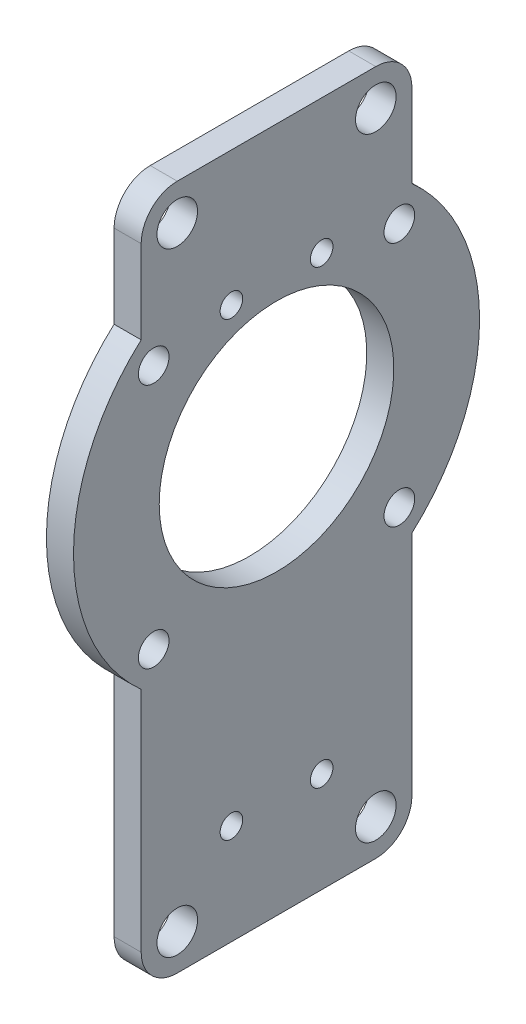
ISO-10303-21;
HEADER;
FILE_DESCRIPTION(('STEP AP214'),'2;1');
FILE_NAME('part.step','',(''),(''),'','','');
FILE_SCHEMA(('AUTOMOTIVE_DESIGN { 1 0 10303 214 1 1 1 1 }'));
ENDSEC;
DATA;
#1=APPLICATION_CONTEXT('core data for automotive mechanical design processes');
#2=APPLICATION_PROTOCOL_DEFINITION('international standard','automotive_design',2000,#1);
#3=PRODUCT_CONTEXT('',#1,'mechanical');
#4=PRODUCT('Part','Part','',(#3));
#5=PRODUCT_RELATED_PRODUCT_CATEGORY('part','',(#4));
#6=PRODUCT_DEFINITION_FORMATION('','',#4);
#7=PRODUCT_DEFINITION_CONTEXT('part definition',#1,'design');
#8=PRODUCT_DEFINITION('design','',#6,#7);
#9=PRODUCT_DEFINITION_SHAPE('','',#8);
#10=(LENGTH_UNIT() NAMED_UNIT(*) SI_UNIT(.MILLI.,.METRE.));
#11=(NAMED_UNIT(*) PLANE_ANGLE_UNIT() SI_UNIT($,.RADIAN.));
#12=(NAMED_UNIT(*) SI_UNIT($,.STERADIAN.) SOLID_ANGLE_UNIT());
#13=UNCERTAINTY_MEASURE_WITH_UNIT(LENGTH_MEASURE(1.E-05),#10,'distance_accuracy_value','');
#14=(GEOMETRIC_REPRESENTATION_CONTEXT(3) GLOBAL_UNCERTAINTY_ASSIGNED_CONTEXT((#13)) GLOBAL_UNIT_ASSIGNED_CONTEXT((#10,
#11,#12)) REPRESENTATION_CONTEXT('',''));
#15=CARTESIAN_POINT('',(0.,0.,0.));
#16=DIRECTION('',(0.,0.,1.));
#17=DIRECTION('',(1.,0.,0.));
#18=AXIS2_PLACEMENT_3D('',#15,#16,#17);
#19=CARTESIAN_POINT('',(0.,76.,0.));
#20=DIRECTION('',(1.,0.,0.));
#21=DIRECTION('',(0.,0.,-1.));
#22=AXIS2_PLACEMENT_3D('',#19,#20,#21);
#23=PLANE('',#22);
#24=CARTESIAN_POINT('',(0.,61.12,20.));
#25=DIRECTION('',(-1.,0.,0.));
#26=DIRECTION('',(0.,0.,1.));
#27=AXIS2_PLACEMENT_3D('',#24,#25,#26);
#28=CIRCLE('',#27,1.24999999999999);
#29=CARTESIAN_POINT('',(0.,61.12,21.25));
#30=VERTEX_POINT('',#29);
#31=EDGE_CURVE('E305',#30,#30,#28,.T.);
#32=ORIENTED_EDGE('',*,*,#31,.F.);
#33=EDGE_LOOP('',(#32));
#34=FACE_BOUND('',#33,.T.);
#35=CARTESIAN_POINT('',(0.,11.12,20.));
#36=DIRECTION('',(-1.,0.,0.));
#37=DIRECTION('',(0.,0.,1.));
#38=AXIS2_PLACEMENT_3D('',#35,#36,#37);
#39=CIRCLE('',#38,1.24999999999999);
#40=CARTESIAN_POINT('',(0.,11.12,21.25));
#41=VERTEX_POINT('',#40);
#42=EDGE_CURVE('E293',#41,#41,#39,.T.);
#43=ORIENTED_EDGE('',*,*,#42,.F.);
#44=EDGE_LOOP('',(#43));
#45=FACE_BOUND('',#44,.T.);
#46=CARTESIAN_POINT('',(0.,72.,26.));
#47=DIRECTION('',(1.,0.,0.));
#48=DIRECTION('',(0.,0.,-1.));
#49=AXIS2_PLACEMENT_3D('',#46,#47,#48);
#50=CIRCLE('',#49,2.25);
#51=CARTESIAN_POINT('',(0.,72.,23.75));
#52=VERTEX_POINT('',#51);
#53=EDGE_CURVE('E284',#52,#52,#50,.T.);
#54=ORIENTED_EDGE('',*,*,#53,.T.);
#55=EDGE_LOOP('',(#54));
#56=FACE_BOUND('',#55,.T.);
#57=CARTESIAN_POINT('',(0.,72.,3.99999999999999));
#58=DIRECTION('',(1.,0.,0.));
#59=DIRECTION('',(0.,0.,-1.));
#60=AXIS2_PLACEMENT_3D('',#57,#58,#59);
#61=CIRCLE('',#60,2.25);
#62=CARTESIAN_POINT('',(0.,72.,1.74999999999999));
#63=VERTEX_POINT('',#62);
#64=EDGE_CURVE('E278',#63,#63,#61,.T.);
#65=ORIENTED_EDGE('',*,*,#64,.T.);
#66=EDGE_LOOP('',(#65));
#67=FACE_BOUND('',#66,.T.);
#68=CARTESIAN_POINT('',(0.,4.,4.));
#69=DIRECTION('',(1.,0.,0.));
#70=DIRECTION('',(0.,0.,-1.));
#71=AXIS2_PLACEMENT_3D('',#68,#69,#70);
#72=CIRCLE('',#71,2.25);
#73=CARTESIAN_POINT('',(0.,4.,1.75));
#74=VERTEX_POINT('',#73);
#75=EDGE_CURVE('E272',#74,#74,#72,.T.);
#76=ORIENTED_EDGE('',*,*,#75,.T.);
#77=EDGE_LOOP('',(#76));
#78=FACE_BOUND('',#77,.T.);
#79=CARTESIAN_POINT('',(0.,4.,26.));
#80=DIRECTION('',(1.,0.,0.));
#81=DIRECTION('',(0.,0.,-1.));
#82=AXIS2_PLACEMENT_3D('',#79,#80,#81);
#83=CIRCLE('',#82,2.25);
#84=CARTESIAN_POINT('',(0.,4.,23.75));
#85=VERTEX_POINT('',#84);
#86=EDGE_CURVE('E266',#85,#85,#83,.T.);
#87=ORIENTED_EDGE('',*,*,#86,.T.);
#88=EDGE_LOOP('',(#87));
#89=FACE_BOUND('',#88,.T.);
#90=CARTESIAN_POINT('',(0.,59.6118055378411,28.6118055378411));
#91=DIRECTION('',(1.,0.,0.));
#92=DIRECTION('',(0.,0.,-1.));
#93=AXIS2_PLACEMENT_3D('',#90,#91,#92);
#94=CIRCLE('',#93,1.7);
#95=CARTESIAN_POINT('',(0.,59.6118055378411,26.9118055378411));
#96=VERTEX_POINT('',#95);
#97=EDGE_CURVE('E260',#96,#96,#94,.T.);
#98=ORIENTED_EDGE('',*,*,#97,.T.);
#99=EDGE_LOOP('',(#98));
#100=FACE_BOUND('',#99,.T.);
#101=CARTESIAN_POINT('',(0.,59.6118055378411,1.38819446215899));
#102=DIRECTION('',(1.,0.,0.));
#103=DIRECTION('',(0.,0.,-1.));
#104=AXIS2_PLACEMENT_3D('',#101,#102,#103);
#105=CIRCLE('',#104,1.7);
#106=CARTESIAN_POINT('',(0.,59.6118055378411,-0.311805537841006));
#107=VERTEX_POINT('',#106);
#108=EDGE_CURVE('E254',#107,#107,#105,.T.);
#109=ORIENTED_EDGE('',*,*,#108,.T.);
#110=EDGE_LOOP('',(#109));
#111=FACE_BOUND('',#110,.T.);
#112=CARTESIAN_POINT('',(0.,32.388194462159,1.38819446215893));
#113=DIRECTION('',(1.,0.,0.));
#114=DIRECTION('',(0.,0.,-1.));
#115=AXIS2_PLACEMENT_3D('',#112,#113,#114);
#116=CIRCLE('',#115,1.7);
#117=CARTESIAN_POINT('',(0.,32.388194462159,-0.311805537841071));
#118=VERTEX_POINT('',#117);
#119=EDGE_CURVE('E248',#118,#118,#116,.T.);
#120=ORIENTED_EDGE('',*,*,#119,.T.);
#121=EDGE_LOOP('',(#120));
#122=FACE_BOUND('',#121,.T.);
#123=CARTESIAN_POINT('',(0.,32.3881944621591,28.611805537841));
#124=DIRECTION('',(1.,0.,0.));
#125=DIRECTION('',(0.,0.,-1.));
#126=AXIS2_PLACEMENT_3D('',#123,#124,#125);
#127=CIRCLE('',#126,1.7);
#128=CARTESIAN_POINT('',(0.,32.3881944621591,26.911805537841));
#129=VERTEX_POINT('',#128);
#130=EDGE_CURVE('E241',#129,#129,#127,.T.);
#131=ORIENTED_EDGE('',*,*,#130,.T.);
#132=EDGE_LOOP('',(#131));
#133=FACE_BOUND('',#132,.T.);
#134=CARTESIAN_POINT('',(0.,46.,15.));
#135=DIRECTION('',(-1.,0.,0.));
#136=DIRECTION('',(0.,0.,1.));
#137=AXIS2_PLACEMENT_3D('',#134,#135,#136);
#138=CIRCLE('',#137,13.);
#139=CARTESIAN_POINT('',(0.,46.,28.));
#140=VERTEX_POINT('',#139);
#141=EDGE_CURVE('E236',#140,#140,#138,.T.);
#142=ORIENTED_EDGE('',*,*,#141,.F.);
#143=EDGE_LOOP('',(#142));
#144=FACE_BOUND('',#143,.T.);
#145=DIRECTION('',(0.,-1.,0.));
#146=VECTOR('',#145,1.);
#147=CARTESIAN_POINT('',(0.,76.,0.));
#148=LINE('',#147,#146);
#149=CARTESIAN_POINT('',(0.,29.2294901687516,0.));
#150=VERTEX_POINT('',#149);
#151=CARTESIAN_POINT('',(0.,4.,0.));
#152=VERTEX_POINT('',#151);
#153=EDGE_CURVE('E144',#150,#152,#148,.T.);
#154=ORIENTED_EDGE('',*,*,#153,.T.);
#155=CARTESIAN_POINT('',(0.,4.,4.));
#156=DIRECTION('',(1.,0.,0.));
#157=DIRECTION('',(0.,0.,-1.));
#158=AXIS2_PLACEMENT_3D('',#155,#156,#157);
#159=CIRCLE('',#158,4.);
#160=CARTESIAN_POINT('',(0.,0.,4.));
#161=VERTEX_POINT('',#160);
#162=EDGE_CURVE('E193',#152,#161,#159,.F.);
#163=ORIENTED_EDGE('',*,*,#162,.T.);
#164=DIRECTION('',(0.,0.,1.));
#165=VECTOR('',#164,1.);
#166=CARTESIAN_POINT('',(0.,0.,0.));
#167=LINE('',#166,#165);
#168=CARTESIAN_POINT('',(0.,0.,26.));
#169=VERTEX_POINT('',#168);
#170=EDGE_CURVE('E167',#161,#169,#167,.T.);
#171=ORIENTED_EDGE('',*,*,#170,.T.);
#172=CARTESIAN_POINT('',(0.,4.,26.));
#173=DIRECTION('',(1.,0.,0.));
#174=DIRECTION('',(0.,0.,-1.));
#175=AXIS2_PLACEMENT_3D('',#172,#173,#174);
#176=CIRCLE('',#175,4.);
#177=CARTESIAN_POINT('',(0.,4.,30.));
#178=VERTEX_POINT('',#177);
#179=EDGE_CURVE('E191',#169,#178,#176,.F.);
#180=ORIENTED_EDGE('',*,*,#179,.T.);
#181=DIRECTION('',(0.,-1.,0.));
#182=VECTOR('',#181,1.);
#183=CARTESIAN_POINT('',(0.,76.,30.));
#184=LINE('',#183,#182);
#185=CARTESIAN_POINT('',(0.,29.2294901687516,30.));
#186=VERTEX_POINT('',#185);
#187=EDGE_CURVE('E182',#186,#178,#184,.T.);
#188=ORIENTED_EDGE('',*,*,#187,.F.);
#189=CARTESIAN_POINT('',(0.,46.,15.));
#190=DIRECTION('',(-1.,0.,0.));
#191=DIRECTION('',(0.,0.,1.));
#192=AXIS2_PLACEMENT_3D('',#189,#190,#191);
#193=CIRCLE('',#192,22.5);
#194=CARTESIAN_POINT('',(0.,62.7705098312484,30.));
#195=VERTEX_POINT('',#194);
#196=EDGE_CURVE('E162',#186,#195,#193,.T.);
#197=ORIENTED_EDGE('',*,*,#196,.T.);
#198=CARTESIAN_POINT('',(0.,72.,30.));
#199=VERTEX_POINT('',#198);
#200=EDGE_CURVE('E149',#199,#195,#184,.T.);
#201=ORIENTED_EDGE('',*,*,#200,.F.);
#202=CARTESIAN_POINT('',(0.,72.,26.));
#203=DIRECTION('',(1.,0.,0.));
#204=DIRECTION('',(0.,0.,-1.));
#205=AXIS2_PLACEMENT_3D('',#202,#203,#204);
#206=CIRCLE('',#205,4.);
#207=CARTESIAN_POINT('',(0.,76.,26.));
#208=VERTEX_POINT('',#207);
#209=EDGE_CURVE('E189',#199,#208,#206,.F.);
#210=ORIENTED_EDGE('',*,*,#209,.T.);
#211=DIRECTION('',(0.,0.,1.));
#212=VECTOR('',#211,1.);
#213=CARTESIAN_POINT('',(0.,76.,0.));
#214=LINE('',#213,#212);
#215=CARTESIAN_POINT('',(0.,76.,4.));
#216=VERTEX_POINT('',#215);
#217=EDGE_CURVE('E168',#216,#208,#214,.T.);
#218=ORIENTED_EDGE('',*,*,#217,.F.);
#219=CARTESIAN_POINT('',(0.,72.,4.));
#220=DIRECTION('',(1.,0.,0.));
#221=DIRECTION('',(0.,0.,-1.));
#222=AXIS2_PLACEMENT_3D('',#219,#220,#221);
#223=CIRCLE('',#222,4.);
#224=CARTESIAN_POINT('',(0.,72.,0.));
#225=VERTEX_POINT('',#224);
#226=EDGE_CURVE('E187',#216,#225,#223,.F.);
#227=ORIENTED_EDGE('',*,*,#226,.T.);
#228=CARTESIAN_POINT('',(0.,62.7705098312484,0.));
#229=VERTEX_POINT('',#228);
#230=EDGE_CURVE('E138',#225,#229,#148,.T.);
#231=ORIENTED_EDGE('',*,*,#230,.T.);
#232=EDGE_CURVE('E160',#229,#150,#193,.T.);
#233=ORIENTED_EDGE('',*,*,#232,.T.);
#234=EDGE_LOOP('',(#154,#163,#171,#180,#188,#197,#201,#210,#218,#227,#231,#233));
#235=FACE_BOUND('',#234,.T.);
#236=CARTESIAN_POINT('',(0.,11.12,9.99999999999999));
#237=DIRECTION('',(-1.,0.,0.));
#238=DIRECTION('',(0.,0.,1.));
#239=AXIS2_PLACEMENT_3D('',#236,#237,#238);
#240=CIRCLE('',#239,1.24999999999999);
#241=CARTESIAN_POINT('',(0.,11.12,11.25));
#242=VERTEX_POINT('',#241);
#243=EDGE_CURVE('E299',#242,#242,#240,.T.);
#244=ORIENTED_EDGE('',*,*,#243,.F.);
#245=EDGE_LOOP('',(#244));
#246=FACE_BOUND('',#245,.T.);
#247=CARTESIAN_POINT('',(0.,61.12,10.));
#248=DIRECTION('',(-1.,0.,0.));
#249=DIRECTION('',(0.,0.,1.));
#250=AXIS2_PLACEMENT_3D('',#247,#248,#249);
#251=CIRCLE('',#250,1.24999999999999);
#252=CARTESIAN_POINT('',(0.,61.12,11.25));
#253=VERTEX_POINT('',#252);
#254=EDGE_CURVE('E311',#253,#253,#251,.T.);
#255=ORIENTED_EDGE('',*,*,#254,.F.);
#256=EDGE_LOOP('',(#255));
#257=FACE_BOUND('',#256,.T.);
#258=ADVANCED_FACE('F37',(#34,#45,#56,#67,#78,#89,#100,#111,#122,#133,#144,#235,#246,#257),#23,.F.);
#259=CARTESIAN_POINT('',(0.,76.,30.));
#260=DIRECTION('',(0.,0.,-1.));
#261=DIRECTION('',(-1.,0.,0.));
#262=AXIS2_PLACEMENT_3D('',#259,#260,#261);
#263=PLANE('',#262);
#264=ORIENTED_EDGE('',*,*,#187,.T.);
#265=DIRECTION('',(1.,0.,0.));
#266=VECTOR('',#265,1.);
#267=CARTESIAN_POINT('',(0.,4.,30.));
#268=LINE('',#267,#266);
#269=CARTESIAN_POINT('',(3.,4.,30.));
#270=VERTEX_POINT('',#269);
#271=EDGE_CURVE('E204',#178,#270,#268,.T.);
#272=ORIENTED_EDGE('',*,*,#271,.T.);
#273=DIRECTION('',(0.,-1.,0.));
#274=VECTOR('',#273,1.);
#275=CARTESIAN_POINT('',(3.,76.,30.));
#276=LINE('',#275,#274);
#277=CARTESIAN_POINT('',(3.,29.2294901687516,30.));
#278=VERTEX_POINT('',#277);
#279=EDGE_CURVE('E179',#278,#270,#276,.T.);
#280=ORIENTED_EDGE('',*,*,#279,.F.);
#281=DIRECTION('',(-1.,0.,0.));
#282=VECTOR('',#281,1.);
#283=CARTESIAN_POINT('',(66.6396103067893,29.2294901687516,30.));
#284=LINE('',#283,#282);
#285=EDGE_CURVE('E158',#278,#186,#284,.T.);
#286=ORIENTED_EDGE('',*,*,#285,.T.);
#287=EDGE_LOOP('',(#264,#272,#280,#286));
#288=FACE_BOUND('',#287,.T.);
#289=ADVANCED_FACE('F318',(#288),#263,.F.);
#290=CARTESIAN_POINT('',(0.,76.,0.));
#291=DIRECTION('',(0.,0.,1.));
#292=DIRECTION('',(1.,0.,0.));
#293=AXIS2_PLACEMENT_3D('',#290,#291,#292);
#294=PLANE('',#293);
#295=ORIENTED_EDGE('',*,*,#230,.F.);
#296=DIRECTION('',(-1.,0.,0.));
#297=VECTOR('',#296,1.);
#298=CARTESIAN_POINT('',(3.,72.,0.));
#299=LINE('',#298,#297);
#300=CARTESIAN_POINT('',(3.,72.,0.));
#301=VERTEX_POINT('',#300);
#302=EDGE_CURVE('E11',#225,#301,#299,.F.);
#303=ORIENTED_EDGE('',*,*,#302,.T.);
#304=DIRECTION('',(0.,-1.,0.));
#305=VECTOR('',#304,1.);
#306=CARTESIAN_POINT('',(3.,76.,0.));
#307=LINE('',#306,#305);
#308=CARTESIAN_POINT('',(3.,62.7705098312484,0.));
#309=VERTEX_POINT('',#308);
#310=EDGE_CURVE('E137',#301,#309,#307,.T.);
#311=ORIENTED_EDGE('',*,*,#310,.T.);
#312=DIRECTION('',(-1.,0.,0.));
#313=VECTOR('',#312,1.);
#314=CARTESIAN_POINT('',(66.6396103067893,62.7705098312484,0.));
#315=LINE('',#314,#313);
#316=EDGE_CURVE('E148',#309,#229,#315,.T.);
#317=ORIENTED_EDGE('',*,*,#316,.T.);
#318=EDGE_LOOP('',(#295,#303,#311,#317));
#319=FACE_BOUND('',#318,.T.);
#320=ADVANCED_FACE('F233',(#319),#294,.F.);
#321=CARTESIAN_POINT('',(3.,72.,30.));
#322=VERTEX_POINT('',#321);
#323=CARTESIAN_POINT('',(3.,62.7705098312484,30.));
#324=VERTEX_POINT('',#323);
#325=EDGE_CURVE('E180',#322,#324,#276,.T.);
#326=ORIENTED_EDGE('',*,*,#325,.F.);
#327=DIRECTION('',(1.,0.,0.));
#328=VECTOR('',#327,1.);
#329=CARTESIAN_POINT('',(0.,72.,30.));
#330=LINE('',#329,#328);
#331=EDGE_CURVE('E45',#322,#199,#330,.F.);
#332=ORIENTED_EDGE('',*,*,#331,.T.);
#333=ORIENTED_EDGE('',*,*,#200,.T.);
#334=DIRECTION('',(-1.,0.,0.));
#335=VECTOR('',#334,1.);
#336=CARTESIAN_POINT('',(66.6396103067893,62.7705098312484,30.));
#337=LINE('',#336,#335);
#338=EDGE_CURVE('E154',#195,#324,#337,.F.);
#339=ORIENTED_EDGE('',*,*,#338,.T.);
#340=EDGE_LOOP('',(#326,#332,#333,#339));
#341=FACE_BOUND('',#340,.T.);
#342=ADVANCED_FACE('F214',(#341),#263,.F.);
#343=CARTESIAN_POINT('',(3.,76.,0.));
#344=DIRECTION('',(-1.,0.,0.));
#345=DIRECTION('',(0.,0.,1.));
#346=AXIS2_PLACEMENT_3D('',#343,#344,#345);
#347=PLANE('',#346);
#348=CARTESIAN_POINT('',(3.,61.12,10.));
#349=DIRECTION('',(-1.,0.,0.));
#350=DIRECTION('',(0.,0.,1.));
#351=AXIS2_PLACEMENT_3D('',#348,#349,#350);
#352=CIRCLE('',#351,1.24999999999999);
#353=CARTESIAN_POINT('',(3.,61.12,11.25));
#354=VERTEX_POINT('',#353);
#355=EDGE_CURVE('E308',#354,#354,#352,.T.);
#356=ORIENTED_EDGE('',*,*,#355,.T.);
#357=EDGE_LOOP('',(#356));
#358=FACE_BOUND('',#357,.T.);
#359=CARTESIAN_POINT('',(3.,61.12,20.));
#360=DIRECTION('',(-1.,0.,0.));
#361=DIRECTION('',(0.,0.,1.));
#362=AXIS2_PLACEMENT_3D('',#359,#360,#361);
#363=CIRCLE('',#362,1.24999999999999);
#364=CARTESIAN_POINT('',(3.,61.12,21.25));
#365=VERTEX_POINT('',#364);
#366=EDGE_CURVE('E302',#365,#365,#363,.T.);
#367=ORIENTED_EDGE('',*,*,#366,.T.);
#368=EDGE_LOOP('',(#367));
#369=FACE_BOUND('',#368,.T.);
#370=CARTESIAN_POINT('',(3.,11.12,9.99999999999999));
#371=DIRECTION('',(-1.,0.,0.));
#372=DIRECTION('',(0.,0.,1.));
#373=AXIS2_PLACEMENT_3D('',#370,#371,#372);
#374=CIRCLE('',#373,1.24999999999999);
#375=CARTESIAN_POINT('',(3.,11.12,11.25));
#376=VERTEX_POINT('',#375);
#377=EDGE_CURVE('E296',#376,#376,#374,.T.);
#378=ORIENTED_EDGE('',*,*,#377,.T.);
#379=EDGE_LOOP('',(#378));
#380=FACE_BOUND('',#379,.T.);
#381=CARTESIAN_POINT('',(3.,11.12,20.));
#382=DIRECTION('',(-1.,0.,0.));
#383=DIRECTION('',(0.,0.,1.));
#384=AXIS2_PLACEMENT_3D('',#381,#382,#383);
#385=CIRCLE('',#384,1.24999999999999);
#386=CARTESIAN_POINT('',(3.,11.12,21.25));
#387=VERTEX_POINT('',#386);
#388=EDGE_CURVE('E290',#387,#387,#385,.T.);
#389=ORIENTED_EDGE('',*,*,#388,.T.);
#390=EDGE_LOOP('',(#389));
#391=FACE_BOUND('',#390,.T.);
#392=CARTESIAN_POINT('',(3.,72.,26.));
#393=DIRECTION('',(1.,0.,0.));
#394=DIRECTION('',(0.,0.,-1.));
#395=AXIS2_PLACEMENT_3D('',#392,#393,#394);
#396=CIRCLE('',#395,2.25);
#397=CARTESIAN_POINT('',(3.,72.,23.75));
#398=VERTEX_POINT('',#397);
#399=EDGE_CURVE('E287',#398,#398,#396,.T.);
#400=ORIENTED_EDGE('',*,*,#399,.F.);
#401=EDGE_LOOP('',(#400));
#402=FACE_BOUND('',#401,.T.);
#403=CARTESIAN_POINT('',(3.,72.,3.99999999999999));
#404=DIRECTION('',(1.,0.,0.));
#405=DIRECTION('',(0.,0.,-1.));
#406=AXIS2_PLACEMENT_3D('',#403,#404,#405);
#407=CIRCLE('',#406,2.25);
#408=CARTESIAN_POINT('',(3.,72.,1.74999999999999));
#409=VERTEX_POINT('',#408);
#410=EDGE_CURVE('E281',#409,#409,#407,.T.);
#411=ORIENTED_EDGE('',*,*,#410,.F.);
#412=EDGE_LOOP('',(#411));
#413=FACE_BOUND('',#412,.T.);
#414=CARTESIAN_POINT('',(3.,4.,4.));
#415=DIRECTION('',(1.,0.,0.));
#416=DIRECTION('',(0.,0.,-1.));
#417=AXIS2_PLACEMENT_3D('',#414,#415,#416);
#418=CIRCLE('',#417,2.25);
#419=CARTESIAN_POINT('',(3.,4.,1.75));
#420=VERTEX_POINT('',#419);
#421=EDGE_CURVE('E275',#420,#420,#418,.T.);
#422=ORIENTED_EDGE('',*,*,#421,.F.);
#423=EDGE_LOOP('',(#422));
#424=FACE_BOUND('',#423,.T.);
#425=CARTESIAN_POINT('',(3.,4.,26.));
#426=DIRECTION('',(1.,0.,0.));
#427=DIRECTION('',(0.,0.,-1.));
#428=AXIS2_PLACEMENT_3D('',#425,#426,#427);
#429=CIRCLE('',#428,2.25);
#430=CARTESIAN_POINT('',(3.,4.,23.75));
#431=VERTEX_POINT('',#430);
#432=EDGE_CURVE('E269',#431,#431,#429,.T.);
#433=ORIENTED_EDGE('',*,*,#432,.F.);
#434=EDGE_LOOP('',(#433));
#435=FACE_BOUND('',#434,.T.);
#436=CARTESIAN_POINT('',(3.,59.6118055378411,28.6118055378411));
#437=DIRECTION('',(1.,0.,0.));
#438=DIRECTION('',(0.,0.,-1.));
#439=AXIS2_PLACEMENT_3D('',#436,#437,#438);
#440=CIRCLE('',#439,1.7);
#441=CARTESIAN_POINT('',(3.,59.6118055378411,26.9118055378411));
#442=VERTEX_POINT('',#441);
#443=EDGE_CURVE('E263',#442,#442,#440,.T.);
#444=ORIENTED_EDGE('',*,*,#443,.F.);
#445=EDGE_LOOP('',(#444));
#446=FACE_BOUND('',#445,.T.);
#447=CARTESIAN_POINT('',(3.,59.6118055378411,1.38819446215899));
#448=DIRECTION('',(1.,0.,0.));
#449=DIRECTION('',(0.,0.,-1.));
#450=AXIS2_PLACEMENT_3D('',#447,#448,#449);
#451=CIRCLE('',#450,1.7);
#452=CARTESIAN_POINT('',(3.,59.6118055378411,-0.311805537841006));
#453=VERTEX_POINT('',#452);
#454=EDGE_CURVE('E257',#453,#453,#451,.T.);
#455=ORIENTED_EDGE('',*,*,#454,.F.);
#456=EDGE_LOOP('',(#455));
#457=FACE_BOUND('',#456,.T.);
#458=CARTESIAN_POINT('',(3.,32.388194462159,1.38819446215893));
#459=DIRECTION('',(1.,0.,0.));
#460=DIRECTION('',(0.,0.,-1.));
#461=AXIS2_PLACEMENT_3D('',#458,#459,#460);
#462=CIRCLE('',#461,1.7);
#463=CARTESIAN_POINT('',(3.,32.388194462159,-0.311805537841071));
#464=VERTEX_POINT('',#463);
#465=EDGE_CURVE('E251',#464,#464,#462,.T.);
#466=ORIENTED_EDGE('',*,*,#465,.F.);
#467=EDGE_LOOP('',(#466));
#468=FACE_BOUND('',#467,.T.);
#469=CARTESIAN_POINT('',(3.,32.3881944621591,28.611805537841));
#470=DIRECTION('',(1.,0.,0.));
#471=DIRECTION('',(0.,0.,-1.));
#472=AXIS2_PLACEMENT_3D('',#469,#470,#471);
#473=CIRCLE('',#472,1.7);
#474=CARTESIAN_POINT('',(3.,32.3881944621591,26.911805537841));
#475=VERTEX_POINT('',#474);
#476=EDGE_CURVE('E245',#475,#475,#473,.T.);
#477=ORIENTED_EDGE('',*,*,#476,.F.);
#478=EDGE_LOOP('',(#477));
#479=FACE_BOUND('',#478,.T.);
#480=CARTESIAN_POINT('',(3.00000000000001,46.,15.));
#481=DIRECTION('',(-1.,0.,0.));
#482=DIRECTION('',(0.,0.,1.));
#483=AXIS2_PLACEMENT_3D('',#480,#481,#482);
#484=CIRCLE('',#483,13.);
#485=CARTESIAN_POINT('',(3.00000000000001,46.,28.));
#486=VERTEX_POINT('',#485);
#487=EDGE_CURVE('E234',#486,#486,#484,.T.);
#488=ORIENTED_EDGE('',*,*,#487,.T.);
#489=EDGE_LOOP('',(#488));
#490=FACE_BOUND('',#489,.T.);
#491=DIRECTION('',(0.,0.,-1.));
#492=VECTOR('',#491,1.);
#493=CARTESIAN_POINT('',(3.,0.,0.));
#494=LINE('',#493,#492);
#495=CARTESIAN_POINT('',(3.,0.,26.));
#496=VERTEX_POINT('',#495);
#497=CARTESIAN_POINT('',(3.,0.,4.));
#498=VERTEX_POINT('',#497);
#499=EDGE_CURVE('E172',#496,#498,#494,.T.);
#500=ORIENTED_EDGE('',*,*,#499,.T.);
#501=CARTESIAN_POINT('',(3.,4.,4.));
#502=DIRECTION('',(-1.,0.,0.));
#503=DIRECTION('',(0.,0.,1.));
#504=AXIS2_PLACEMENT_3D('',#501,#502,#503);
#505=CIRCLE('',#504,4.);
#506=CARTESIAN_POINT('',(3.,4.,0.));
#507=VERTEX_POINT('',#506);
#508=EDGE_CURVE('E133',#498,#507,#505,.F.);
#509=ORIENTED_EDGE('',*,*,#508,.T.);
#510=CARTESIAN_POINT('',(3.,29.2294901687516,0.));
#511=VERTEX_POINT('',#510);
#512=EDGE_CURVE('E125',#511,#507,#307,.T.);
#513=ORIENTED_EDGE('',*,*,#512,.F.);
#514=CARTESIAN_POINT('',(3.,46.,15.));
#515=DIRECTION('',(-1.,0.,0.));
#516=DIRECTION('',(0.,0.,1.));
#517=AXIS2_PLACEMENT_3D('',#514,#515,#516);
#518=CIRCLE('',#517,22.5);
#519=EDGE_CURVE('E131',#511,#309,#518,.F.);
#520=ORIENTED_EDGE('',*,*,#519,.T.);
#521=ORIENTED_EDGE('',*,*,#310,.F.);
#522=CARTESIAN_POINT('',(3.,72.,4.));
#523=DIRECTION('',(-1.,0.,0.));
#524=DIRECTION('',(0.,0.,1.));
#525=AXIS2_PLACEMENT_3D('',#522,#523,#524);
#526=CIRCLE('',#525,4.);
#527=CARTESIAN_POINT('',(3.,76.,4.));
#528=VERTEX_POINT('',#527);
#529=EDGE_CURVE('E199',#301,#528,#526,.F.);
#530=ORIENTED_EDGE('',*,*,#529,.T.);
#531=DIRECTION('',(0.,0.,-1.));
#532=VECTOR('',#531,1.);
#533=CARTESIAN_POINT('',(3.,76.,0.));
#534=LINE('',#533,#532);
#535=CARTESIAN_POINT('',(3.,76.,26.));
#536=VERTEX_POINT('',#535);
#537=EDGE_CURVE('E171',#536,#528,#534,.T.);
#538=ORIENTED_EDGE('',*,*,#537,.F.);
#539=CARTESIAN_POINT('',(3.,72.,26.));
#540=DIRECTION('',(-1.,0.,0.));
#541=DIRECTION('',(0.,0.,1.));
#542=AXIS2_PLACEMENT_3D('',#539,#540,#541);
#543=CIRCLE('',#542,4.);
#544=EDGE_CURVE('E60',#536,#322,#543,.F.);
#545=ORIENTED_EDGE('',*,*,#544,.T.);
#546=ORIENTED_EDGE('',*,*,#325,.T.);
#547=EDGE_CURVE('E155',#324,#278,#518,.F.);
#548=ORIENTED_EDGE('',*,*,#547,.T.);
#549=ORIENTED_EDGE('',*,*,#279,.T.);
#550=CARTESIAN_POINT('',(3.,4.,26.));
#551=DIRECTION('',(-1.,0.,0.));
#552=DIRECTION('',(0.,0.,1.));
#553=AXIS2_PLACEMENT_3D('',#550,#551,#552);
#554=CIRCLE('',#553,4.);
#555=EDGE_CURVE('E52',#270,#496,#554,.F.);
#556=ORIENTED_EDGE('',*,*,#555,.T.);
#557=EDGE_LOOP('',(#500,#509,#513,#520,#521,#530,#538,#545,#546,#548,#549,#556));
#558=FACE_BOUND('',#557,.T.);
#559=ADVANCED_FACE('F128',(#358,#369,#380,#391,#402,#413,#424,#435,#446,#457,#468,#479,#490,
#558),#347,.F.);
#560=ORIENTED_EDGE('',*,*,#512,.T.);
#561=DIRECTION('',(-1.,0.,0.));
#562=VECTOR('',#561,1.);
#563=CARTESIAN_POINT('',(0.,4.,0.));
#564=LINE('',#563,#562);
#565=EDGE_CURVE('E185',#507,#152,#564,.T.);
#566=ORIENTED_EDGE('',*,*,#565,.T.);
#567=ORIENTED_EDGE('',*,*,#153,.F.);
#568=DIRECTION('',(-1.,0.,0.));
#569=VECTOR('',#568,1.);
#570=CARTESIAN_POINT('',(66.6396103067893,29.2294901687516,0.));
#571=LINE('',#570,#569);
#572=EDGE_CURVE('E141',#150,#511,#571,.F.);
#573=ORIENTED_EDGE('',*,*,#572,.T.);
#574=EDGE_LOOP('',(#560,#566,#567,#573));
#575=FACE_BOUND('',#574,.T.);
#576=ADVANCED_FACE('F142',(#575),#294,.F.);
#577=CARTESIAN_POINT('',(0.,76.,0.));
#578=DIRECTION('',(0.,1.,0.));
#579=DIRECTION('',(0.,0.,1.));
#580=AXIS2_PLACEMENT_3D('',#577,#578,#579);
#581=PLANE('',#580);
#582=ORIENTED_EDGE('',*,*,#217,.T.);
#583=DIRECTION('',(1.,0.,0.));
#584=VECTOR('',#583,1.);
#585=CARTESIAN_POINT('',(3.,76.,26.));
#586=LINE('',#585,#584);
#587=EDGE_CURVE('E209',#208,#536,#586,.T.);
#588=ORIENTED_EDGE('',*,*,#587,.T.);
#589=ORIENTED_EDGE('',*,*,#537,.T.);
#590=DIRECTION('',(-1.,0.,0.));
#591=VECTOR('',#590,1.);
#592=CARTESIAN_POINT('',(0.,76.,4.));
#593=LINE('',#592,#591);
#594=EDGE_CURVE('E206',#528,#216,#593,.T.);
#595=ORIENTED_EDGE('',*,*,#594,.T.);
#596=EDGE_LOOP('',(#582,#588,#589,#595));
#597=FACE_BOUND('',#596,.T.);
#598=ADVANCED_FACE('F226',(#597),#581,.T.);
#599=CARTESIAN_POINT('',(0.,0.,0.));
#600=DIRECTION('',(0.,1.,0.));
#601=DIRECTION('',(0.,0.,1.));
#602=AXIS2_PLACEMENT_3D('',#599,#600,#601);
#603=PLANE('',#602);
#604=ORIENTED_EDGE('',*,*,#170,.F.);
#605=DIRECTION('',(-1.,0.,0.));
#606=VECTOR('',#605,1.);
#607=CARTESIAN_POINT('',(0.,0.,4.));
#608=LINE('',#607,#606);
#609=EDGE_CURVE('E197',#161,#498,#608,.F.);
#610=ORIENTED_EDGE('',*,*,#609,.T.);
#611=ORIENTED_EDGE('',*,*,#499,.F.);
#612=DIRECTION('',(1.,0.,0.));
#613=VECTOR('',#612,1.);
#614=CARTESIAN_POINT('',(0.,0.,26.));
#615=LINE('',#614,#613);
#616=EDGE_CURVE('E195',#496,#169,#615,.F.);
#617=ORIENTED_EDGE('',*,*,#616,.T.);
#618=EDGE_LOOP('',(#604,#610,#611,#617));
#619=FACE_BOUND('',#618,.T.);
#620=ADVANCED_FACE('F399',(#619),#603,.F.);
#621=CARTESIAN_POINT('',(66.6396103067893,46.,15.));
#622=DIRECTION('',(-1.,0.,0.));
#623=DIRECTION('',(0.,0.,1.));
#624=AXIS2_PLACEMENT_3D('',#621,#622,#623);
#625=CYLINDRICAL_SURFACE('',#624,22.5);
#626=ORIENTED_EDGE('',*,*,#316,.F.);
#627=ORIENTED_EDGE('',*,*,#519,.F.);
#628=ORIENTED_EDGE('',*,*,#572,.F.);
#629=ORIENTED_EDGE('',*,*,#232,.F.);
#630=EDGE_LOOP('',(#626,#627,#628,#629));
#631=FACE_BOUND('',#630,.T.);
#632=ADVANCED_FACE('F152',(#631),#625,.T.);
#633=ORIENTED_EDGE('',*,*,#285,.F.);
#634=ORIENTED_EDGE('',*,*,#547,.F.);
#635=ORIENTED_EDGE('',*,*,#338,.F.);
#636=ORIENTED_EDGE('',*,*,#196,.F.);
#637=EDGE_LOOP('',(#633,#634,#635,#636));
#638=FACE_BOUND('',#637,.T.);
#639=ADVANCED_FACE('F392',(#638),#625,.T.);
#640=CARTESIAN_POINT('',(3.00000000000001,46.,15.));
#641=DIRECTION('',(-1.,0.,0.));
#642=DIRECTION('',(0.,0.,1.));
#643=AXIS2_PLACEMENT_3D('',#640,#641,#642);
#644=CYLINDRICAL_SURFACE('',#643,13.);
#645=ORIENTED_EDGE('',*,*,#487,.F.);
#646=EDGE_LOOP('',(#645));
#647=FACE_BOUND('',#646,.T.);
#648=ORIENTED_EDGE('',*,*,#141,.T.);
#649=EDGE_LOOP('',(#648));
#650=FACE_BOUND('',#649,.T.);
#651=ADVANCED_FACE('F388',(#647,#650),#644,.F.);
#652=CARTESIAN_POINT('',(3.,32.3881944621591,28.611805537841));
#653=DIRECTION('',(1.,0.,0.));
#654=DIRECTION('',(0.,0.,-1.));
#655=AXIS2_PLACEMENT_3D('',#652,#653,#654);
#656=CYLINDRICAL_SURFACE('',#655,1.7);
#657=ORIENTED_EDGE('',*,*,#130,.F.);
#658=EDGE_LOOP('',(#657));
#659=FACE_BOUND('',#658,.T.);
#660=ORIENTED_EDGE('',*,*,#476,.T.);
#661=EDGE_LOOP('',(#660));
#662=FACE_BOUND('',#661,.T.);
#663=ADVANCED_FACE('F384',(#659,#662),#656,.F.);
#664=CARTESIAN_POINT('',(3.,32.388194462159,1.38819446215893));
#665=DIRECTION('',(1.,0.,0.));
#666=DIRECTION('',(0.,0.,-1.));
#667=AXIS2_PLACEMENT_3D('',#664,#665,#666);
#668=CYLINDRICAL_SURFACE('',#667,1.7);
#669=ORIENTED_EDGE('',*,*,#119,.F.);
#670=EDGE_LOOP('',(#669));
#671=FACE_BOUND('',#670,.T.);
#672=ORIENTED_EDGE('',*,*,#465,.T.);
#673=EDGE_LOOP('',(#672));
#674=FACE_BOUND('',#673,.T.);
#675=ADVANCED_FACE('F380',(#671,#674),#668,.F.);
#676=CARTESIAN_POINT('',(3.,59.6118055378411,1.38819446215899));
#677=DIRECTION('',(1.,0.,0.));
#678=DIRECTION('',(0.,0.,-1.));
#679=AXIS2_PLACEMENT_3D('',#676,#677,#678);
#680=CYLINDRICAL_SURFACE('',#679,1.7);
#681=ORIENTED_EDGE('',*,*,#108,.F.);
#682=EDGE_LOOP('',(#681));
#683=FACE_BOUND('',#682,.T.);
#684=ORIENTED_EDGE('',*,*,#454,.T.);
#685=EDGE_LOOP('',(#684));
#686=FACE_BOUND('',#685,.T.);
#687=ADVANCED_FACE('F376',(#683,#686),#680,.F.);
#688=CARTESIAN_POINT('',(3.,59.6118055378411,28.6118055378411));
#689=DIRECTION('',(1.,0.,0.));
#690=DIRECTION('',(0.,0.,-1.));
#691=AXIS2_PLACEMENT_3D('',#688,#689,#690);
#692=CYLINDRICAL_SURFACE('',#691,1.7);
#693=ORIENTED_EDGE('',*,*,#97,.F.);
#694=EDGE_LOOP('',(#693));
#695=FACE_BOUND('',#694,.T.);
#696=ORIENTED_EDGE('',*,*,#443,.T.);
#697=EDGE_LOOP('',(#696));
#698=FACE_BOUND('',#697,.T.);
#699=ADVANCED_FACE('F372',(#695,#698),#692,.F.);
#700=CARTESIAN_POINT('',(3.,4.,26.));
#701=DIRECTION('',(1.,0.,0.));
#702=DIRECTION('',(0.,0.,-1.));
#703=AXIS2_PLACEMENT_3D('',#700,#701,#702);
#704=CYLINDRICAL_SURFACE('',#703,2.25);
#705=ORIENTED_EDGE('',*,*,#86,.F.);
#706=EDGE_LOOP('',(#705));
#707=FACE_BOUND('',#706,.T.);
#708=ORIENTED_EDGE('',*,*,#432,.T.);
#709=EDGE_LOOP('',(#708));
#710=FACE_BOUND('',#709,.T.);
#711=ADVANCED_FACE('F368',(#707,#710),#704,.F.);
#712=CARTESIAN_POINT('',(3.,4.,4.));
#713=DIRECTION('',(1.,0.,0.));
#714=DIRECTION('',(0.,0.,-1.));
#715=AXIS2_PLACEMENT_3D('',#712,#713,#714);
#716=CYLINDRICAL_SURFACE('',#715,2.25);
#717=ORIENTED_EDGE('',*,*,#75,.F.);
#718=EDGE_LOOP('',(#717));
#719=FACE_BOUND('',#718,.T.);
#720=ORIENTED_EDGE('',*,*,#421,.T.);
#721=EDGE_LOOP('',(#720));
#722=FACE_BOUND('',#721,.T.);
#723=ADVANCED_FACE('F364',(#719,#722),#716,.F.);
#724=CARTESIAN_POINT('',(3.,72.,3.99999999999999));
#725=DIRECTION('',(1.,0.,0.));
#726=DIRECTION('',(0.,0.,-1.));
#727=AXIS2_PLACEMENT_3D('',#724,#725,#726);
#728=CYLINDRICAL_SURFACE('',#727,2.25);
#729=ORIENTED_EDGE('',*,*,#64,.F.);
#730=EDGE_LOOP('',(#729));
#731=FACE_BOUND('',#730,.T.);
#732=ORIENTED_EDGE('',*,*,#410,.T.);
#733=EDGE_LOOP('',(#732));
#734=FACE_BOUND('',#733,.T.);
#735=ADVANCED_FACE('F360',(#731,#734),#728,.F.);
#736=CARTESIAN_POINT('',(3.,72.,26.));
#737=DIRECTION('',(1.,0.,0.));
#738=DIRECTION('',(0.,0.,-1.));
#739=AXIS2_PLACEMENT_3D('',#736,#737,#738);
#740=CYLINDRICAL_SURFACE('',#739,2.25);
#741=ORIENTED_EDGE('',*,*,#53,.F.);
#742=EDGE_LOOP('',(#741));
#743=FACE_BOUND('',#742,.T.);
#744=ORIENTED_EDGE('',*,*,#399,.T.);
#745=EDGE_LOOP('',(#744));
#746=FACE_BOUND('',#745,.T.);
#747=ADVANCED_FACE('F334',(#743,#746),#740,.F.);
#748=CARTESIAN_POINT('',(0.,4.,4.));
#749=DIRECTION('',(-1.,0.,0.));
#750=DIRECTION('',(0.,0.,1.));
#751=AXIS2_PLACEMENT_3D('',#748,#749,#750);
#752=CYLINDRICAL_SURFACE('',#751,4.);
#753=ORIENTED_EDGE('',*,*,#508,.F.);
#754=ORIENTED_EDGE('',*,*,#609,.F.);
#755=ORIENTED_EDGE('',*,*,#162,.F.);
#756=ORIENTED_EDGE('',*,*,#565,.F.);
#757=EDGE_LOOP('',(#753,#754,#755,#756));
#758=FACE_BOUND('',#757,.T.);
#759=ADVANCED_FACE('F330',(#758),#752,.T.);
#760=CARTESIAN_POINT('',(0.,4.,26.));
#761=DIRECTION('',(1.,0.,0.));
#762=DIRECTION('',(0.,0.,-1.));
#763=AXIS2_PLACEMENT_3D('',#760,#761,#762);
#764=CYLINDRICAL_SURFACE('',#763,4.);
#765=ORIENTED_EDGE('',*,*,#179,.F.);
#766=ORIENTED_EDGE('',*,*,#616,.F.);
#767=ORIENTED_EDGE('',*,*,#555,.F.);
#768=ORIENTED_EDGE('',*,*,#271,.F.);
#769=EDGE_LOOP('',(#765,#766,#767,#768));
#770=FACE_BOUND('',#769,.T.);
#771=ADVANCED_FACE('F333',(#770),#764,.T.);
#772=CARTESIAN_POINT('',(0.,72.,26.));
#773=DIRECTION('',(-1.,0.,0.));
#774=DIRECTION('',(0.,0.,1.));
#775=AXIS2_PLACEMENT_3D('',#772,#773,#774);
#776=CYLINDRICAL_SURFACE('',#775,4.);
#777=ORIENTED_EDGE('',*,*,#209,.F.);
#778=ORIENTED_EDGE('',*,*,#331,.F.);
#779=ORIENTED_EDGE('',*,*,#544,.F.);
#780=ORIENTED_EDGE('',*,*,#587,.F.);
#781=EDGE_LOOP('',(#777,#778,#779,#780));
#782=FACE_BOUND('',#781,.T.);
#783=ADVANCED_FACE('F224',(#782),#776,.T.);
#784=CARTESIAN_POINT('',(0.,72.,4.));
#785=DIRECTION('',(1.,0.,0.));
#786=DIRECTION('',(0.,0.,-1.));
#787=AXIS2_PLACEMENT_3D('',#784,#785,#786);
#788=CYLINDRICAL_SURFACE('',#787,4.);
#789=ORIENTED_EDGE('',*,*,#529,.F.);
#790=ORIENTED_EDGE('',*,*,#302,.F.);
#791=ORIENTED_EDGE('',*,*,#226,.F.);
#792=ORIENTED_EDGE('',*,*,#594,.F.);
#793=EDGE_LOOP('',(#789,#790,#791,#792));
#794=FACE_BOUND('',#793,.T.);
#795=ADVANCED_FACE('F39',(#794),#788,.T.);
#796=CARTESIAN_POINT('',(0.,11.12,20.));
#797=DIRECTION('',(-1.,0.,0.));
#798=DIRECTION('',(0.,0.,1.));
#799=AXIS2_PLACEMENT_3D('',#796,#797,#798);
#800=CYLINDRICAL_SURFACE('',#799,1.24999999999999);
#801=ORIENTED_EDGE('',*,*,#388,.F.);
#802=EDGE_LOOP('',(#801));
#803=FACE_BOUND('',#802,.T.);
#804=ORIENTED_EDGE('',*,*,#42,.T.);
#805=EDGE_LOOP('',(#804));
#806=FACE_BOUND('',#805,.T.);
#807=ADVANCED_FACE('F341',(#803,#806),#800,.F.);
#808=CARTESIAN_POINT('',(0.,11.12,9.99999999999999));
#809=DIRECTION('',(-1.,0.,0.));
#810=DIRECTION('',(0.,0.,1.));
#811=AXIS2_PLACEMENT_3D('',#808,#809,#810);
#812=CYLINDRICAL_SURFACE('',#811,1.24999999999999);
#813=ORIENTED_EDGE('',*,*,#377,.F.);
#814=EDGE_LOOP('',(#813));
#815=FACE_BOUND('',#814,.T.);
#816=ORIENTED_EDGE('',*,*,#243,.T.);
#817=EDGE_LOOP('',(#816));
#818=FACE_BOUND('',#817,.T.);
#819=ADVANCED_FACE('F345',(#815,#818),#812,.F.);
#820=CARTESIAN_POINT('',(0.,61.12,20.));
#821=DIRECTION('',(-1.,0.,0.));
#822=DIRECTION('',(0.,0.,1.));
#823=AXIS2_PLACEMENT_3D('',#820,#821,#822);
#824=CYLINDRICAL_SURFACE('',#823,1.24999999999999);
#825=ORIENTED_EDGE('',*,*,#366,.F.);
#826=EDGE_LOOP('',(#825));
#827=FACE_BOUND('',#826,.T.);
#828=ORIENTED_EDGE('',*,*,#31,.T.);
#829=EDGE_LOOP('',(#828));
#830=FACE_BOUND('',#829,.T.);
#831=ADVANCED_FACE('F351',(#827,#830),#824,.F.);
#832=CARTESIAN_POINT('',(0.,61.12,10.));
#833=DIRECTION('',(-1.,0.,0.));
#834=DIRECTION('',(0.,0.,1.));
#835=AXIS2_PLACEMENT_3D('',#832,#833,#834);
#836=CYLINDRICAL_SURFACE('',#835,1.24999999999999);
#837=ORIENTED_EDGE('',*,*,#355,.F.);
#838=EDGE_LOOP('',(#837));
#839=FACE_BOUND('',#838,.T.);
#840=ORIENTED_EDGE('',*,*,#254,.T.);
#841=EDGE_LOOP('',(#840));
#842=FACE_BOUND('',#841,.T.);
#843=ADVANCED_FACE('F315',(#839,#842),#836,.F.);
#844=CLOSED_SHELL('',(#258,#289,#320,#342,#559,#576,#598,#620,#632,#639,#651,#663,#675,#687,
#699,#711,#723,#735,#747,#759,#771,#783,#795,#807,#819,#831,#843));
#845=MANIFOLD_SOLID_BREP('B2',#844);
#846=ADVANCED_BREP_SHAPE_REPRESENTATION('',(#18,#845),#14);
#847=SHAPE_DEFINITION_REPRESENTATION(#9,#846);
ENDSEC;
END-ISO-10303-21;
